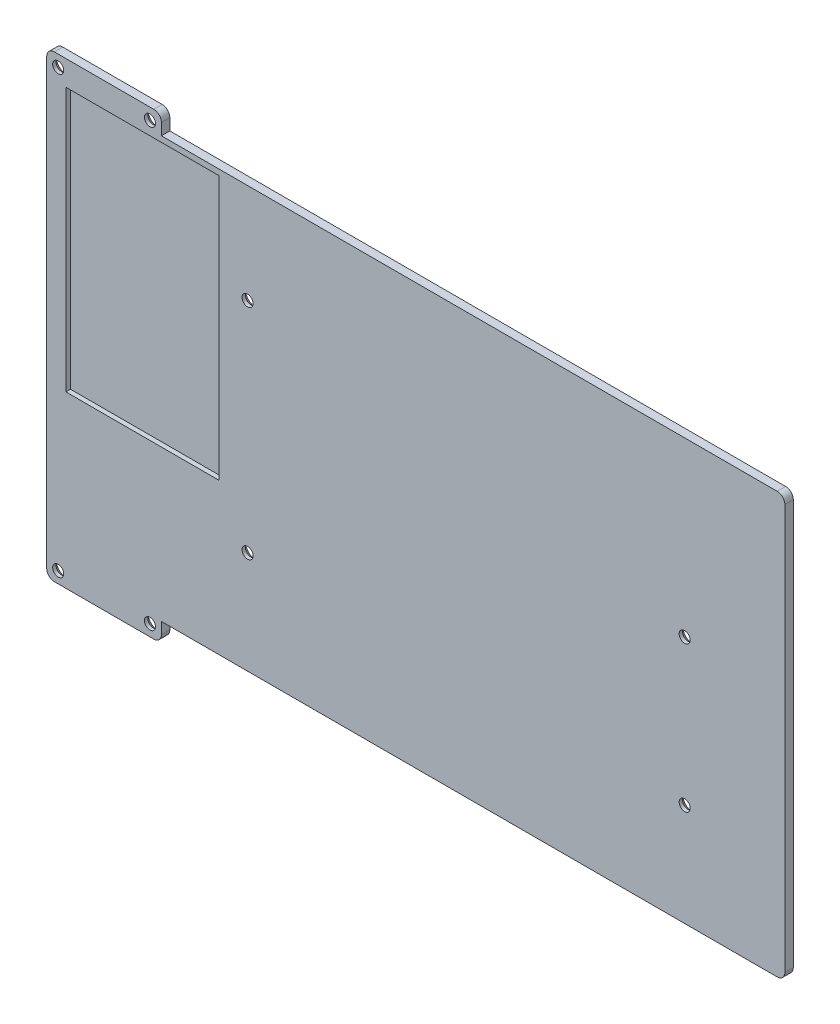
ISO-10303-21;
HEADER;
FILE_DESCRIPTION(('STEP AP214'),'2;1');
FILE_NAME('part.step','',(''),(''),'','','');
FILE_SCHEMA(('AUTOMOTIVE_DESIGN { 1 0 10303 214 1 1 1 1 }'));
ENDSEC;
DATA;
#1=APPLICATION_CONTEXT('core data for automotive mechanical design processes');
#2=APPLICATION_PROTOCOL_DEFINITION('international standard','automotive_design',2000,#1);
#3=PRODUCT_CONTEXT('',#1,'mechanical');
#4=PRODUCT('Part','Part','',(#3));
#5=PRODUCT_RELATED_PRODUCT_CATEGORY('part','',(#4));
#6=PRODUCT_DEFINITION_FORMATION('','',#4);
#7=PRODUCT_DEFINITION_CONTEXT('part definition',#1,'design');
#8=PRODUCT_DEFINITION('design','',#6,#7);
#9=PRODUCT_DEFINITION_SHAPE('','',#8);
#10=(LENGTH_UNIT() NAMED_UNIT(*) SI_UNIT(.MILLI.,.METRE.));
#11=(NAMED_UNIT(*) PLANE_ANGLE_UNIT() SI_UNIT($,.RADIAN.));
#12=(NAMED_UNIT(*) SI_UNIT($,.STERADIAN.) SOLID_ANGLE_UNIT());
#13=UNCERTAINTY_MEASURE_WITH_UNIT(LENGTH_MEASURE(1.E-05),#10,'distance_accuracy_value','');
#14=(GEOMETRIC_REPRESENTATION_CONTEXT(3) GLOBAL_UNCERTAINTY_ASSIGNED_CONTEXT((#13)) GLOBAL_UNIT_ASSIGNED_CONTEXT((#10,
#11,#12)) REPRESENTATION_CONTEXT('',''));
#15=CARTESIAN_POINT('',(0.,0.,0.));
#16=DIRECTION('',(0.,0.,1.));
#17=DIRECTION('',(1.,0.,0.));
#18=AXIS2_PLACEMENT_3D('',#15,#16,#17);
#19=CARTESIAN_POINT('',(59.8774272560033,-20.5678939773836,2.2));
#20=DIRECTION('',(0.,0.,1.));
#21=DIRECTION('',(1.,0.,0.));
#22=AXIS2_PLACEMENT_3D('',#19,#20,#21);
#23=PLANE('',#22);
#24=CARTESIAN_POINT('',(-104.172572743997,89.4321060226163,2.19999999999999));
#25=DIRECTION('',(0.,0.,-1.));
#26=DIRECTION('',(-1.,0.,0.));
#27=AXIS2_PLACEMENT_3D('',#24,#25,#26);
#28=CIRCLE('',#27,1.44999999999999);
#29=CARTESIAN_POINT('',(-105.622572743997,89.4321060226163,2.19999999999999));
#30=VERTEX_POINT('',#29);
#31=EDGE_CURVE('E285',#30,#30,#28,.T.);
#32=ORIENTED_EDGE('',*,*,#31,.T.);
#33=EDGE_LOOP('',(#32));
#34=FACE_BOUND('',#33,.T.);
#35=CARTESIAN_POINT('',(-128.172572743997,89.4321060226163,2.19999999999999));
#36=DIRECTION('',(0.,0.,-1.));
#37=DIRECTION('',(-1.,0.,0.));
#38=AXIS2_PLACEMENT_3D('',#35,#36,#37);
#39=CIRCLE('',#38,1.44999999999998);
#40=CARTESIAN_POINT('',(-129.622572743997,89.4321060226163,2.19999999999999));
#41=VERTEX_POINT('',#40);
#42=EDGE_CURVE('E294',#41,#41,#39,.T.);
#43=ORIENTED_EDGE('',*,*,#42,.T.);
#44=EDGE_LOOP('',(#43));
#45=FACE_BOUND('',#44,.T.);
#46=CARTESIAN_POINT('',(-104.172572743997,-24.5678939773836,2.19999999999999));
#47=DIRECTION('',(0.,0.,-1.));
#48=DIRECTION('',(-1.,0.,0.));
#49=AXIS2_PLACEMENT_3D('',#46,#47,#48);
#50=CIRCLE('',#49,1.44999999999999);
#51=CARTESIAN_POINT('',(-105.622572743997,-24.5678939773836,2.19999999999999));
#52=VERTEX_POINT('',#51);
#53=EDGE_CURVE('E303',#52,#52,#50,.T.);
#54=ORIENTED_EDGE('',*,*,#53,.T.);
#55=EDGE_LOOP('',(#54));
#56=FACE_BOUND('',#55,.T.);
#57=CARTESIAN_POINT('',(-128.172572743997,-24.5678939773836,2.19999999999999));
#58=DIRECTION('',(0.,0.,-1.));
#59=DIRECTION('',(-1.,0.,0.));
#60=AXIS2_PLACEMENT_3D('',#57,#58,#59);
#61=CIRCLE('',#60,1.44999999999998);
#62=CARTESIAN_POINT('',(-129.622572743997,-24.5678939773836,2.19999999999999));
#63=VERTEX_POINT('',#62);
#64=EDGE_CURVE('E312',#63,#63,#61,.T.);
#65=ORIENTED_EDGE('',*,*,#64,.T.);
#66=EDGE_LOOP('',(#65));
#67=FACE_BOUND('',#66,.T.);
#68=CARTESIAN_POINT('',(-78.6475727439967,61.3919922588539,2.2));
#69=DIRECTION('',(0.,0.,-1.));
#70=DIRECTION('',(-1.,0.,0.));
#71=AXIS2_PLACEMENT_3D('',#68,#69,#70);
#72=CIRCLE('',#71,1.44999999999999);
#73=CARTESIAN_POINT('',(-80.0975727439967,61.3919922588539,2.2));
#74=VERTEX_POINT('',#73);
#75=EDGE_CURVE('E321',#74,#74,#72,.T.);
#76=ORIENTED_EDGE('',*,*,#75,.T.);
#77=EDGE_LOOP('',(#76));
#78=FACE_BOUND('',#77,.T.);
#79=CARTESIAN_POINT('',(35.6774272560033,42.3419922588539,2.2));
#80=DIRECTION('',(0.,0.,-1.));
#81=DIRECTION('',(-1.,0.,0.));
#82=AXIS2_PLACEMENT_3D('',#79,#80,#81);
#83=CIRCLE('',#82,1.45);
#84=CARTESIAN_POINT('',(34.2274272560033,42.3419922588539,2.2));
#85=VERTEX_POINT('',#84);
#86=EDGE_CURVE('E330',#85,#85,#83,.T.);
#87=ORIENTED_EDGE('',*,*,#86,.T.);
#88=EDGE_LOOP('',(#87));
#89=FACE_BOUND('',#88,.T.);
#90=CARTESIAN_POINT('',(35.6774272560033,4.24199225885395,2.2));
#91=DIRECTION('',(0.,0.,-1.));
#92=DIRECTION('',(-1.,0.,0.));
#93=AXIS2_PLACEMENT_3D('',#90,#91,#92);
#94=CIRCLE('',#93,1.45);
#95=CARTESIAN_POINT('',(34.2274272560033,4.24199225885395,2.2));
#96=VERTEX_POINT('',#95);
#97=EDGE_CURVE('E339',#96,#96,#94,.T.);
#98=ORIENTED_EDGE('',*,*,#97,.T.);
#99=EDGE_LOOP('',(#98));
#100=FACE_BOUND('',#99,.T.);
#101=CARTESIAN_POINT('',(-78.6475727439967,4.24199225885394,2.2));
#102=DIRECTION('',(0.,0.,-1.));
#103=DIRECTION('',(-1.,0.,0.));
#104=AXIS2_PLACEMENT_3D('',#101,#102,#103);
#105=CIRCLE('',#104,1.44999999999999);
#106=CARTESIAN_POINT('',(-80.0975727439967,4.24199225885394,2.2));
#107=VERTEX_POINT('',#106);
#108=EDGE_CURVE('E190',#107,#107,#105,.T.);
#109=ORIENTED_EDGE('',*,*,#108,.T.);
#110=EDGE_LOOP('',(#109));
#111=FACE_BOUND('',#110,.T.);
#112=CARTESIAN_POINT('',(59.8774272560033,-20.5678939773836,2.2));
#113=DIRECTION('',(0.,0.,1.));
#114=DIRECTION('',(1.,0.,0.));
#115=AXIS2_PLACEMENT_3D('',#112,#113,#114);
#116=CIRCLE('',#115,2.);
#117=CARTESIAN_POINT('',(59.8774272560033,-22.5678939773836,2.2));
#118=VERTEX_POINT('',#117);
#119=CARTESIAN_POINT('',(61.8774272560033,-20.5678939773836,2.2));
#120=VERTEX_POINT('',#119);
#121=EDGE_CURVE('E214',#118,#120,#116,.T.);
#122=ORIENTED_EDGE('',*,*,#121,.T.);
#123=DIRECTION('',(0.,1.,0.));
#124=VECTOR('',#123,1.);
#125=CARTESIAN_POINT('',(61.8774272560033,-20.5678939773836,2.2));
#126=LINE('',#125,#124);
#127=CARTESIAN_POINT('',(61.8774272560033,85.4321060226164,2.2));
#128=VERTEX_POINT('',#127);
#129=EDGE_CURVE('E125',#120,#128,#126,.T.);
#130=ORIENTED_EDGE('',*,*,#129,.T.);
#131=CARTESIAN_POINT('',(59.8774272560033,85.4321060226164,2.2));
#132=DIRECTION('',(0.,0.,1.));
#133=DIRECTION('',(-1.,0.,0.));
#134=AXIS2_PLACEMENT_3D('',#131,#132,#133);
#135=CIRCLE('',#134,2.);
#136=CARTESIAN_POINT('',(59.8774272560033,87.4321060226164,2.2));
#137=VERTEX_POINT('',#136);
#138=EDGE_CURVE('E352',#128,#137,#135,.T.);
#139=ORIENTED_EDGE('',*,*,#138,.T.);
#140=DIRECTION('',(-1.,0.,0.));
#141=VECTOR('',#140,1.);
#142=CARTESIAN_POINT('',(59.8774272560033,87.4321060226164,2.2));
#143=LINE('',#142,#141);
#144=CARTESIAN_POINT('',(-101.172572743997,87.4321060226164,2.2));
#145=VERTEX_POINT('',#144);
#146=EDGE_CURVE('E354',#137,#145,#143,.T.);
#147=ORIENTED_EDGE('',*,*,#146,.T.);
#148=DIRECTION('',(0.,1.,0.));
#149=VECTOR('',#148,1.);
#150=CARTESIAN_POINT('',(-101.172572743997,87.4321060226164,2.2));
#151=LINE('',#150,#149);
#152=CARTESIAN_POINT('',(-101.172572743997,90.4321060226163,2.2));
#153=VERTEX_POINT('',#152);
#154=EDGE_CURVE('E356',#145,#153,#151,.T.);
#155=ORIENTED_EDGE('',*,*,#154,.T.);
#156=CARTESIAN_POINT('',(-103.172572743997,90.4321060226163,2.2));
#157=DIRECTION('',(0.,0.,1.));
#158=DIRECTION('',(-1.,0.,0.));
#159=AXIS2_PLACEMENT_3D('',#156,#157,#158);
#160=CIRCLE('',#159,1.99999999999999);
#161=CARTESIAN_POINT('',(-103.172572743997,92.4321060226163,2.2));
#162=VERTEX_POINT('',#161);
#163=EDGE_CURVE('E358',#153,#162,#160,.T.);
#164=ORIENTED_EDGE('',*,*,#163,.T.);
#165=DIRECTION('',(-1.,0.,0.));
#166=VECTOR('',#165,1.);
#167=CARTESIAN_POINT('',(-129.172572743997,92.4321060226164,2.2));
#168=LINE('',#167,#166);
#169=CARTESIAN_POINT('',(-129.172572743997,92.4321060226164,2.2));
#170=VERTEX_POINT('',#169);
#171=EDGE_CURVE('E360',#162,#170,#168,.T.);
#172=ORIENTED_EDGE('',*,*,#171,.T.);
#173=CARTESIAN_POINT('',(-129.172572743997,90.4321060226164,2.2));
#174=DIRECTION('',(0.,0.,1.));
#175=DIRECTION('',(-1.,0.,0.));
#176=AXIS2_PLACEMENT_3D('',#173,#174,#175);
#177=CIRCLE('',#176,2.00000000000002);
#178=CARTESIAN_POINT('',(-131.172572743997,90.4321060226164,2.2));
#179=VERTEX_POINT('',#178);
#180=EDGE_CURVE('E362',#170,#179,#177,.T.);
#181=ORIENTED_EDGE('',*,*,#180,.T.);
#182=DIRECTION('',(0.,-1.,0.));
#183=VECTOR('',#182,1.);
#184=CARTESIAN_POINT('',(-131.172572743997,-25.5678939773836,2.2));
#185=LINE('',#184,#183);
#186=CARTESIAN_POINT('',(-131.172572743997,-25.5678939773836,2.2));
#187=VERTEX_POINT('',#186);
#188=EDGE_CURVE('E364',#179,#187,#185,.T.);
#189=ORIENTED_EDGE('',*,*,#188,.T.);
#190=CARTESIAN_POINT('',(-129.172572743997,-25.5678939773836,2.2));
#191=DIRECTION('',(0.,0.,1.));
#192=DIRECTION('',(-1.,0.,0.));
#193=AXIS2_PLACEMENT_3D('',#190,#191,#192);
#194=CIRCLE('',#193,2.00000000000001);
#195=CARTESIAN_POINT('',(-129.172572743997,-27.5678939773836,2.2));
#196=VERTEX_POINT('',#195);
#197=EDGE_CURVE('E366',#187,#196,#194,.T.);
#198=ORIENTED_EDGE('',*,*,#197,.T.);
#199=DIRECTION('',(1.,0.,0.));
#200=VECTOR('',#199,1.);
#201=CARTESIAN_POINT('',(-129.172572743997,-27.5678939773836,2.2));
#202=LINE('',#201,#200);
#203=CARTESIAN_POINT('',(-103.172572743997,-27.5678939773836,2.2));
#204=VERTEX_POINT('',#203);
#205=EDGE_CURVE('E165',#196,#204,#202,.T.);
#206=ORIENTED_EDGE('',*,*,#205,.T.);
#207=CARTESIAN_POINT('',(-103.172572743997,-25.5678939773836,2.2));
#208=DIRECTION('',(0.,0.,1.));
#209=DIRECTION('',(1.,0.,0.));
#210=AXIS2_PLACEMENT_3D('',#207,#208,#209);
#211=CIRCLE('',#210,2.);
#212=CARTESIAN_POINT('',(-101.172572743997,-25.5678939773836,2.2));
#213=VERTEX_POINT('',#212);
#214=EDGE_CURVE('E158',#204,#213,#211,.T.);
#215=ORIENTED_EDGE('',*,*,#214,.T.);
#216=DIRECTION('',(0.,1.,0.));
#217=VECTOR('',#216,1.);
#218=CARTESIAN_POINT('',(-101.172572743997,-22.5678939773836,2.2));
#219=LINE('',#218,#217);
#220=CARTESIAN_POINT('',(-101.172572743997,-22.5678939773836,2.2));
#221=VERTEX_POINT('',#220);
#222=EDGE_CURVE('E162',#213,#221,#219,.T.);
#223=ORIENTED_EDGE('',*,*,#222,.T.);
#224=DIRECTION('',(1.,0.,0.));
#225=VECTOR('',#224,1.);
#226=CARTESIAN_POINT('',(59.8774272560033,-22.5678939773836,2.2));
#227=LINE('',#226,#225);
#228=EDGE_CURVE('E65',#221,#118,#227,.T.);
#229=ORIENTED_EDGE('',*,*,#228,.T.);
#230=EDGE_LOOP('',(#122,#130,#139,#147,#155,#164,#172,#181,#189,#198,#206,#215,#223,#229));
#231=FACE_BOUND('',#230,.T.);
#232=DIRECTION('',(-1.,0.,0.));
#233=VECTOR('',#232,1.);
#234=CARTESIAN_POINT('',(59.8774272560033,16.9321060226164,2.2));
#235=LINE('',#234,#233);
#236=CARTESIAN_POINT('',(-86.1725727439967,16.9321060226164,2.2));
#237=VERTEX_POINT('',#236);
#238=CARTESIAN_POINT('',(-126.172572743997,16.9321060226164,2.2));
#239=VERTEX_POINT('',#238);
#240=EDGE_CURVE('E49',#237,#239,#235,.T.);
#241=ORIENTED_EDGE('',*,*,#240,.T.);
#242=DIRECTION('',(0.,1.,0.));
#243=VECTOR('',#242,1.);
#244=CARTESIAN_POINT('',(-126.172572743997,-20.5678939773836,2.2));
#245=LINE('',#244,#243);
#246=CARTESIAN_POINT('',(-126.172572743997,85.9321060226164,2.2));
#247=VERTEX_POINT('',#246);
#248=EDGE_CURVE('E11',#239,#247,#245,.T.);
#249=ORIENTED_EDGE('',*,*,#248,.T.);
#250=DIRECTION('',(1.,0.,0.));
#251=VECTOR('',#250,1.);
#252=CARTESIAN_POINT('',(59.8774272560033,85.9321060226164,2.2));
#253=LINE('',#252,#251);
#254=CARTESIAN_POINT('',(-86.1725727439967,85.9321060226164,2.2));
#255=VERTEX_POINT('',#254);
#256=EDGE_CURVE('E247',#247,#255,#253,.T.);
#257=ORIENTED_EDGE('',*,*,#256,.T.);
#258=DIRECTION('',(0.,-1.,0.));
#259=VECTOR('',#258,1.);
#260=CARTESIAN_POINT('',(-86.1725727439967,-20.5678939773836,2.2));
#261=LINE('',#260,#259);
#262=EDGE_CURVE('E250',#255,#237,#261,.T.);
#263=ORIENTED_EDGE('',*,*,#262,.T.);
#264=EDGE_LOOP('',(#241,#249,#257,#263));
#265=FACE_BOUND('',#264,.T.);
#266=ADVANCED_FACE('F41',(#34,#45,#56,#67,#78,#89,#100,#111,#231,#265),#23,.T.);
#267=CARTESIAN_POINT('',(59.8774272560033,-20.5678939773836,0.));
#268=DIRECTION('',(0.,0.,1.));
#269=DIRECTION('',(1.,0.,0.));
#270=AXIS2_PLACEMENT_3D('',#267,#268,#269);
#271=PLANE('',#270);
#272=CARTESIAN_POINT('',(-104.172572743997,89.4321060226163,0.));
#273=DIRECTION('',(0.,0.,-1.));
#274=DIRECTION('',(-1.,0.,0.));
#275=AXIS2_PLACEMENT_3D('',#272,#273,#274);
#276=CIRCLE('',#275,2.75);
#277=CARTESIAN_POINT('',(-106.922572743997,89.4321060226163,0.));
#278=VERTEX_POINT('',#277);
#279=EDGE_CURVE('E274',#278,#278,#276,.T.);
#280=ORIENTED_EDGE('',*,*,#279,.F.);
#281=EDGE_LOOP('',(#280));
#282=FACE_BOUND('',#281,.T.);
#283=CARTESIAN_POINT('',(-128.172572743997,89.4321060226163,0.));
#284=DIRECTION('',(0.,0.,-1.));
#285=DIRECTION('',(-1.,0.,0.));
#286=AXIS2_PLACEMENT_3D('',#283,#284,#285);
#287=CIRCLE('',#286,2.75);
#288=CARTESIAN_POINT('',(-130.922572743997,89.4321060226163,0.));
#289=VERTEX_POINT('',#288);
#290=EDGE_CURVE('E288',#289,#289,#287,.T.);
#291=ORIENTED_EDGE('',*,*,#290,.F.);
#292=EDGE_LOOP('',(#291));
#293=FACE_BOUND('',#292,.T.);
#294=CARTESIAN_POINT('',(-104.172572743997,-24.5678939773836,0.));
#295=DIRECTION('',(0.,0.,-1.));
#296=DIRECTION('',(-1.,0.,0.));
#297=AXIS2_PLACEMENT_3D('',#294,#295,#296);
#298=CIRCLE('',#297,2.75);
#299=CARTESIAN_POINT('',(-106.922572743997,-24.5678939773836,0.));
#300=VERTEX_POINT('',#299);
#301=EDGE_CURVE('E297',#300,#300,#298,.T.);
#302=ORIENTED_EDGE('',*,*,#301,.F.);
#303=EDGE_LOOP('',(#302));
#304=FACE_BOUND('',#303,.T.);
#305=CARTESIAN_POINT('',(-78.6475727439967,61.3919922588539,0.));
#306=DIRECTION('',(0.,0.,-1.));
#307=DIRECTION('',(-1.,0.,0.));
#308=AXIS2_PLACEMENT_3D('',#305,#306,#307);
#309=CIRCLE('',#308,2.75);
#310=CARTESIAN_POINT('',(-81.3975727439967,61.3919922588539,0.));
#311=VERTEX_POINT('',#310);
#312=EDGE_CURVE('E315',#311,#311,#309,.T.);
#313=ORIENTED_EDGE('',*,*,#312,.F.);
#314=EDGE_LOOP('',(#313));
#315=FACE_BOUND('',#314,.T.);
#316=CARTESIAN_POINT('',(35.6774272560033,42.3419922588539,0.));
#317=DIRECTION('',(0.,0.,-1.));
#318=DIRECTION('',(-1.,0.,0.));
#319=AXIS2_PLACEMENT_3D('',#316,#317,#318);
#320=CIRCLE('',#319,2.75);
#321=CARTESIAN_POINT('',(32.9274272560033,42.3419922588539,0.));
#322=VERTEX_POINT('',#321);
#323=EDGE_CURVE('E324',#322,#322,#320,.T.);
#324=ORIENTED_EDGE('',*,*,#323,.F.);
#325=EDGE_LOOP('',(#324));
#326=FACE_BOUND('',#325,.T.);
#327=CARTESIAN_POINT('',(35.6774272560033,4.24199225885395,0.));
#328=DIRECTION('',(0.,0.,-1.));
#329=DIRECTION('',(-1.,0.,0.));
#330=AXIS2_PLACEMENT_3D('',#327,#328,#329);
#331=CIRCLE('',#330,2.75);
#332=CARTESIAN_POINT('',(32.9274272560033,4.24199225885395,0.));
#333=VERTEX_POINT('',#332);
#334=EDGE_CURVE('E333',#333,#333,#331,.T.);
#335=ORIENTED_EDGE('',*,*,#334,.F.);
#336=EDGE_LOOP('',(#335));
#337=FACE_BOUND('',#336,.T.);
#338=CARTESIAN_POINT('',(-78.6475727439967,4.24199225885394,0.));
#339=DIRECTION('',(0.,0.,-1.));
#340=DIRECTION('',(-1.,0.,0.));
#341=AXIS2_PLACEMENT_3D('',#338,#339,#340);
#342=CIRCLE('',#341,2.75);
#343=CARTESIAN_POINT('',(-81.3975727439967,4.24199225885394,0.));
#344=VERTEX_POINT('',#343);
#345=EDGE_CURVE('E342',#344,#344,#342,.T.);
#346=ORIENTED_EDGE('',*,*,#345,.F.);
#347=EDGE_LOOP('',(#346));
#348=FACE_BOUND('',#347,.T.);
#349=CARTESIAN_POINT('',(59.8774272560033,-20.5678939773836,0.));
#350=DIRECTION('',(0.,0.,1.));
#351=DIRECTION('',(1.,0.,0.));
#352=AXIS2_PLACEMENT_3D('',#349,#350,#351);
#353=CIRCLE('',#352,2.);
#354=CARTESIAN_POINT('',(59.8774272560033,-22.5678939773836,0.));
#355=VERTEX_POINT('',#354);
#356=CARTESIAN_POINT('',(61.8774272560033,-20.5678939773836,0.));
#357=VERTEX_POINT('',#356);
#358=EDGE_CURVE('E186',#355,#357,#353,.T.);
#359=ORIENTED_EDGE('',*,*,#358,.F.);
#360=DIRECTION('',(1.,0.,0.));
#361=VECTOR('',#360,1.);
#362=CARTESIAN_POINT('',(59.8774272560033,-22.5678939773836,0.));
#363=LINE('',#362,#361);
#364=CARTESIAN_POINT('',(-101.172572743997,-22.5678939773836,0.));
#365=VERTEX_POINT('',#364);
#366=EDGE_CURVE('E116',#365,#355,#363,.T.);
#367=ORIENTED_EDGE('',*,*,#366,.F.);
#368=DIRECTION('',(0.,1.,0.));
#369=VECTOR('',#368,1.);
#370=CARTESIAN_POINT('',(-101.172572743997,-22.5678939773836,0.));
#371=LINE('',#370,#369);
#372=CARTESIAN_POINT('',(-101.172572743997,-25.5678939773836,0.));
#373=VERTEX_POINT('',#372);
#374=EDGE_CURVE('E211',#373,#365,#371,.T.);
#375=ORIENTED_EDGE('',*,*,#374,.F.);
#376=CARTESIAN_POINT('',(-103.172572743997,-25.5678939773836,0.));
#377=DIRECTION('',(0.,0.,1.));
#378=DIRECTION('',(1.,0.,0.));
#379=AXIS2_PLACEMENT_3D('',#376,#377,#378);
#380=CIRCLE('',#379,2.);
#381=CARTESIAN_POINT('',(-103.172572743997,-27.5678939773836,0.));
#382=VERTEX_POINT('',#381);
#383=EDGE_CURVE('E174',#382,#373,#380,.T.);
#384=ORIENTED_EDGE('',*,*,#383,.F.);
#385=DIRECTION('',(1.,0.,0.));
#386=VECTOR('',#385,1.);
#387=CARTESIAN_POINT('',(-129.172572743997,-27.5678939773836,0.));
#388=LINE('',#387,#386);
#389=CARTESIAN_POINT('',(-129.172572743997,-27.5678939773836,0.));
#390=VERTEX_POINT('',#389);
#391=EDGE_CURVE('E208',#390,#382,#388,.T.);
#392=ORIENTED_EDGE('',*,*,#391,.F.);
#393=CARTESIAN_POINT('',(-129.172572743997,-25.5678939773836,0.));
#394=DIRECTION('',(0.,0.,1.));
#395=DIRECTION('',(-1.,0.,0.));
#396=AXIS2_PLACEMENT_3D('',#393,#394,#395);
#397=CIRCLE('',#396,2.00000000000001);
#398=CARTESIAN_POINT('',(-131.172572743997,-25.5678939773836,0.));
#399=VERTEX_POINT('',#398);
#400=EDGE_CURVE('E206',#399,#390,#397,.T.);
#401=ORIENTED_EDGE('',*,*,#400,.F.);
#402=DIRECTION('',(0.,-1.,0.));
#403=VECTOR('',#402,1.);
#404=CARTESIAN_POINT('',(-131.172572743997,-25.5678939773836,0.));
#405=LINE('',#404,#403);
#406=CARTESIAN_POINT('',(-131.172572743997,90.4321060226164,0.));
#407=VERTEX_POINT('',#406);
#408=EDGE_CURVE('E204',#407,#399,#405,.T.);
#409=ORIENTED_EDGE('',*,*,#408,.F.);
#410=CARTESIAN_POINT('',(-129.172572743997,90.4321060226164,0.));
#411=DIRECTION('',(0.,0.,1.));
#412=DIRECTION('',(-1.,0.,0.));
#413=AXIS2_PLACEMENT_3D('',#410,#411,#412);
#414=CIRCLE('',#413,2.00000000000002);
#415=CARTESIAN_POINT('',(-129.172572743997,92.4321060226164,0.));
#416=VERTEX_POINT('',#415);
#417=EDGE_CURVE('E202',#416,#407,#414,.T.);
#418=ORIENTED_EDGE('',*,*,#417,.F.);
#419=DIRECTION('',(-1.,0.,0.));
#420=VECTOR('',#419,1.);
#421=CARTESIAN_POINT('',(-129.172572743997,92.4321060226164,0.));
#422=LINE('',#421,#420);
#423=CARTESIAN_POINT('',(-103.172572743997,92.4321060226163,0.));
#424=VERTEX_POINT('',#423);
#425=EDGE_CURVE('E200',#424,#416,#422,.T.);
#426=ORIENTED_EDGE('',*,*,#425,.F.);
#427=CARTESIAN_POINT('',(-103.172572743997,90.4321060226163,0.));
#428=DIRECTION('',(0.,0.,1.));
#429=DIRECTION('',(-1.,0.,0.));
#430=AXIS2_PLACEMENT_3D('',#427,#428,#429);
#431=CIRCLE('',#430,1.99999999999999);
#432=CARTESIAN_POINT('',(-101.172572743997,90.4321060226163,0.));
#433=VERTEX_POINT('',#432);
#434=EDGE_CURVE('E198',#433,#424,#431,.T.);
#435=ORIENTED_EDGE('',*,*,#434,.F.);
#436=DIRECTION('',(0.,1.,0.));
#437=VECTOR('',#436,1.);
#438=CARTESIAN_POINT('',(-101.172572743997,87.4321060226164,0.));
#439=LINE('',#438,#437);
#440=CARTESIAN_POINT('',(-101.172572743997,87.4321060226164,0.));
#441=VERTEX_POINT('',#440);
#442=EDGE_CURVE('E196',#441,#433,#439,.T.);
#443=ORIENTED_EDGE('',*,*,#442,.F.);
#444=DIRECTION('',(-1.,0.,0.));
#445=VECTOR('',#444,1.);
#446=CARTESIAN_POINT('',(59.8774272560033,87.4321060226164,0.));
#447=LINE('',#446,#445);
#448=CARTESIAN_POINT('',(59.8774272560033,87.4321060226164,0.));
#449=VERTEX_POINT('',#448);
#450=EDGE_CURVE('E194',#449,#441,#447,.T.);
#451=ORIENTED_EDGE('',*,*,#450,.F.);
#452=CARTESIAN_POINT('',(59.8774272560033,85.4321060226164,0.));
#453=DIRECTION('',(0.,0.,1.));
#454=DIRECTION('',(-1.,0.,0.));
#455=AXIS2_PLACEMENT_3D('',#452,#453,#454);
#456=CIRCLE('',#455,2.);
#457=CARTESIAN_POINT('',(61.8774272560033,85.4321060226164,0.));
#458=VERTEX_POINT('',#457);
#459=EDGE_CURVE('E192',#458,#449,#456,.T.);
#460=ORIENTED_EDGE('',*,*,#459,.F.);
#461=DIRECTION('',(0.,1.,0.));
#462=VECTOR('',#461,1.);
#463=CARTESIAN_POINT('',(61.8774272560033,-20.5678939773836,0.));
#464=LINE('',#463,#462);
#465=EDGE_CURVE('E189',#357,#458,#464,.T.);
#466=ORIENTED_EDGE('',*,*,#465,.F.);
#467=EDGE_LOOP('',(#359,#367,#375,#384,#392,#401,#409,#418,#426,#435,#443,#451,#460,#466));
#468=FACE_BOUND('',#467,.T.);
#469=CARTESIAN_POINT('',(-128.172572743997,-24.5678939773836,0.));
#470=DIRECTION('',(0.,0.,-1.));
#471=DIRECTION('',(-1.,0.,0.));
#472=AXIS2_PLACEMENT_3D('',#469,#470,#471);
#473=CIRCLE('',#472,2.75);
#474=CARTESIAN_POINT('',(-130.922572743997,-24.5678939773836,0.));
#475=VERTEX_POINT('',#474);
#476=EDGE_CURVE('E306',#475,#475,#473,.T.);
#477=ORIENTED_EDGE('',*,*,#476,.F.);
#478=EDGE_LOOP('',(#477));
#479=FACE_BOUND('',#478,.T.);
#480=ADVANCED_FACE('F379',(#282,#293,#304,#315,#326,#337,#348,#468,#479),#271,.F.);
#481=CARTESIAN_POINT('',(59.8774272560033,-20.5678939773836,2.2));
#482=DIRECTION('',(0.,0.,-1.));
#483=DIRECTION('',(-1.,0.,0.));
#484=AXIS2_PLACEMENT_3D('',#481,#482,#483);
#485=CYLINDRICAL_SURFACE('',#484,2.);
#486=ORIENTED_EDGE('',*,*,#358,.T.);
#487=DIRECTION('',(0.,0.,-1.));
#488=VECTOR('',#487,1.);
#489=CARTESIAN_POINT('',(61.8774272560033,-20.5678939773836,2.2));
#490=LINE('',#489,#488);
#491=EDGE_CURVE('E245',#120,#357,#490,.T.);
#492=ORIENTED_EDGE('',*,*,#491,.F.);
#493=ORIENTED_EDGE('',*,*,#121,.F.);
#494=DIRECTION('',(0.,0.,-1.));
#495=VECTOR('',#494,1.);
#496=CARTESIAN_POINT('',(59.8774272560033,-22.5678939773836,2.2));
#497=LINE('',#496,#495);
#498=EDGE_CURVE('E182',#118,#355,#497,.T.);
#499=ORIENTED_EDGE('',*,*,#498,.T.);
#500=EDGE_LOOP('',(#486,#492,#493,#499));
#501=FACE_BOUND('',#500,.T.);
#502=ADVANCED_FACE('F43',(#501),#485,.T.);
#503=CARTESIAN_POINT('',(61.8774272560033,-20.5678939773836,2.2));
#504=DIRECTION('',(-1.,0.,0.));
#505=DIRECTION('',(0.,-1.,0.));
#506=AXIS2_PLACEMENT_3D('',#503,#504,#505);
#507=PLANE('',#506);
#508=ORIENTED_EDGE('',*,*,#465,.T.);
#509=DIRECTION('',(0.,0.,-1.));
#510=VECTOR('',#509,1.);
#511=CARTESIAN_POINT('',(61.8774272560033,85.4321060226164,2.2));
#512=LINE('',#511,#510);
#513=EDGE_CURVE('E242',#128,#458,#512,.T.);
#514=ORIENTED_EDGE('',*,*,#513,.F.);
#515=ORIENTED_EDGE('',*,*,#129,.F.);
#516=ORIENTED_EDGE('',*,*,#491,.T.);
#517=EDGE_LOOP('',(#508,#514,#515,#516));
#518=FACE_BOUND('',#517,.T.);
#519=ADVANCED_FACE('F387',(#518),#507,.F.);
#520=CARTESIAN_POINT('',(59.8774272560033,85.4321060226164,2.2));
#521=DIRECTION('',(0.,0.,-1.));
#522=DIRECTION('',(-1.,0.,0.));
#523=AXIS2_PLACEMENT_3D('',#520,#521,#522);
#524=CYLINDRICAL_SURFACE('',#523,2.);
#525=ORIENTED_EDGE('',*,*,#459,.T.);
#526=DIRECTION('',(0.,0.,-1.));
#527=VECTOR('',#526,1.);
#528=CARTESIAN_POINT('',(59.8774272560033,87.4321060226164,2.2));
#529=LINE('',#528,#527);
#530=EDGE_CURVE('E239',#137,#449,#529,.T.);
#531=ORIENTED_EDGE('',*,*,#530,.F.);
#532=ORIENTED_EDGE('',*,*,#138,.F.);
#533=ORIENTED_EDGE('',*,*,#513,.T.);
#534=EDGE_LOOP('',(#525,#531,#532,#533));
#535=FACE_BOUND('',#534,.T.);
#536=ADVANCED_FACE('F390',(#535),#524,.T.);
#537=CARTESIAN_POINT('',(59.8774272560033,87.4321060226164,2.2));
#538=DIRECTION('',(0.,-1.,0.));
#539=DIRECTION('',(1.,0.,0.));
#540=AXIS2_PLACEMENT_3D('',#537,#538,#539);
#541=PLANE('',#540);
#542=ORIENTED_EDGE('',*,*,#450,.T.);
#543=DIRECTION('',(0.,0.,-1.));
#544=VECTOR('',#543,1.);
#545=CARTESIAN_POINT('',(-101.172572743997,87.4321060226164,2.2));
#546=LINE('',#545,#544);
#547=EDGE_CURVE('E236',#145,#441,#546,.T.);
#548=ORIENTED_EDGE('',*,*,#547,.F.);
#549=ORIENTED_EDGE('',*,*,#146,.F.);
#550=ORIENTED_EDGE('',*,*,#530,.T.);
#551=EDGE_LOOP('',(#542,#548,#549,#550));
#552=FACE_BOUND('',#551,.T.);
#553=ADVANCED_FACE('F395',(#552),#541,.F.);
#554=CARTESIAN_POINT('',(-101.172572743997,87.4321060226164,2.2));
#555=DIRECTION('',(-1.,0.,0.));
#556=DIRECTION('',(0.,0.,1.));
#557=AXIS2_PLACEMENT_3D('',#554,#555,#556);
#558=PLANE('',#557);
#559=ORIENTED_EDGE('',*,*,#442,.T.);
#560=DIRECTION('',(0.,0.,-1.));
#561=VECTOR('',#560,1.);
#562=CARTESIAN_POINT('',(-101.172572743997,90.4321060226163,2.2));
#563=LINE('',#562,#561);
#564=EDGE_CURVE('E233',#153,#433,#563,.T.);
#565=ORIENTED_EDGE('',*,*,#564,.F.);
#566=ORIENTED_EDGE('',*,*,#154,.F.);
#567=ORIENTED_EDGE('',*,*,#547,.T.);
#568=EDGE_LOOP('',(#559,#565,#566,#567));
#569=FACE_BOUND('',#568,.T.);
#570=ADVANCED_FACE('F401',(#569),#558,.F.);
#571=CARTESIAN_POINT('',(-103.172572743997,90.4321060226163,2.2));
#572=DIRECTION('',(0.,0.,-1.));
#573=DIRECTION('',(-1.,0.,0.));
#574=AXIS2_PLACEMENT_3D('',#571,#572,#573);
#575=CYLINDRICAL_SURFACE('',#574,1.99999999999999);
#576=ORIENTED_EDGE('',*,*,#434,.T.);
#577=DIRECTION('',(0.,0.,-1.));
#578=VECTOR('',#577,1.);
#579=CARTESIAN_POINT('',(-103.172572743997,92.4321060226163,2.2));
#580=LINE('',#579,#578);
#581=EDGE_CURVE('E230',#162,#424,#580,.T.);
#582=ORIENTED_EDGE('',*,*,#581,.F.);
#583=ORIENTED_EDGE('',*,*,#163,.F.);
#584=ORIENTED_EDGE('',*,*,#564,.T.);
#585=EDGE_LOOP('',(#576,#582,#583,#584));
#586=FACE_BOUND('',#585,.T.);
#587=ADVANCED_FACE('F405',(#586),#575,.T.);
#588=CARTESIAN_POINT('',(-129.172572743997,92.4321060226164,2.2));
#589=DIRECTION('',(0.,-1.,0.));
#590=DIRECTION('',(1.,0.,0.));
#591=AXIS2_PLACEMENT_3D('',#588,#589,#590);
#592=PLANE('',#591);
#593=ORIENTED_EDGE('',*,*,#425,.T.);
#594=DIRECTION('',(0.,0.,-1.));
#595=VECTOR('',#594,1.);
#596=CARTESIAN_POINT('',(-129.172572743997,92.4321060226164,2.2));
#597=LINE('',#596,#595);
#598=EDGE_CURVE('E227',#170,#416,#597,.T.);
#599=ORIENTED_EDGE('',*,*,#598,.F.);
#600=ORIENTED_EDGE('',*,*,#171,.F.);
#601=ORIENTED_EDGE('',*,*,#581,.T.);
#602=EDGE_LOOP('',(#593,#599,#600,#601));
#603=FACE_BOUND('',#602,.T.);
#604=ADVANCED_FACE('F410',(#603),#592,.F.);
#605=CARTESIAN_POINT('',(-129.172572743997,90.4321060226164,2.2));
#606=DIRECTION('',(0.,0.,-1.));
#607=DIRECTION('',(-1.,0.,0.));
#608=AXIS2_PLACEMENT_3D('',#605,#606,#607);
#609=CYLINDRICAL_SURFACE('',#608,2.00000000000002);
#610=ORIENTED_EDGE('',*,*,#417,.T.);
#611=DIRECTION('',(0.,0.,-1.));
#612=VECTOR('',#611,1.);
#613=CARTESIAN_POINT('',(-131.172572743997,90.4321060226164,2.2));
#614=LINE('',#613,#612);
#615=EDGE_CURVE('E224',#179,#407,#614,.T.);
#616=ORIENTED_EDGE('',*,*,#615,.F.);
#617=ORIENTED_EDGE('',*,*,#180,.F.);
#618=ORIENTED_EDGE('',*,*,#598,.T.);
#619=EDGE_LOOP('',(#610,#616,#617,#618));
#620=FACE_BOUND('',#619,.T.);
#621=ADVANCED_FACE('F414',(#620),#609,.T.);
#622=CARTESIAN_POINT('',(-131.172572743997,-25.5678939773836,2.2));
#623=DIRECTION('',(1.,0.,0.));
#624=DIRECTION('',(0.,0.,-1.));
#625=AXIS2_PLACEMENT_3D('',#622,#623,#624);
#626=PLANE('',#625);
#627=ORIENTED_EDGE('',*,*,#408,.T.);
#628=DIRECTION('',(0.,0.,-1.));
#629=VECTOR('',#628,1.);
#630=CARTESIAN_POINT('',(-131.172572743997,-25.5678939773836,2.2));
#631=LINE('',#630,#629);
#632=EDGE_CURVE('E221',#187,#399,#631,.T.);
#633=ORIENTED_EDGE('',*,*,#632,.F.);
#634=ORIENTED_EDGE('',*,*,#188,.F.);
#635=ORIENTED_EDGE('',*,*,#615,.T.);
#636=EDGE_LOOP('',(#627,#633,#634,#635));
#637=FACE_BOUND('',#636,.T.);
#638=ADVANCED_FACE('F418',(#637),#626,.F.);
#639=CARTESIAN_POINT('',(-129.172572743997,-25.5678939773836,2.2));
#640=DIRECTION('',(0.,0.,-1.));
#641=DIRECTION('',(-1.,0.,0.));
#642=AXIS2_PLACEMENT_3D('',#639,#640,#641);
#643=CYLINDRICAL_SURFACE('',#642,2.00000000000001);
#644=ORIENTED_EDGE('',*,*,#400,.T.);
#645=DIRECTION('',(0.,0.,-1.));
#646=VECTOR('',#645,1.);
#647=CARTESIAN_POINT('',(-129.172572743997,-27.5678939773836,2.2));
#648=LINE('',#647,#646);
#649=EDGE_CURVE('E218',#196,#390,#648,.T.);
#650=ORIENTED_EDGE('',*,*,#649,.F.);
#651=ORIENTED_EDGE('',*,*,#197,.F.);
#652=ORIENTED_EDGE('',*,*,#632,.T.);
#653=EDGE_LOOP('',(#644,#650,#651,#652));
#654=FACE_BOUND('',#653,.T.);
#655=ADVANCED_FACE('F372',(#654),#643,.T.);
#656=CARTESIAN_POINT('',(-129.172572743997,-27.5678939773836,2.2));
#657=DIRECTION('',(0.,1.,0.));
#658=DIRECTION('',(-1.,0.,0.));
#659=AXIS2_PLACEMENT_3D('',#656,#657,#658);
#660=PLANE('',#659);
#661=ORIENTED_EDGE('',*,*,#391,.T.);
#662=DIRECTION('',(0.,0.,-1.));
#663=VECTOR('',#662,1.);
#664=CARTESIAN_POINT('',(-103.172572743997,-27.5678939773836,2.2));
#665=LINE('',#664,#663);
#666=EDGE_CURVE('E177',#204,#382,#665,.T.);
#667=ORIENTED_EDGE('',*,*,#666,.F.);
#668=ORIENTED_EDGE('',*,*,#205,.F.);
#669=ORIENTED_EDGE('',*,*,#649,.T.);
#670=EDGE_LOOP('',(#661,#667,#668,#669));
#671=FACE_BOUND('',#670,.T.);
#672=ADVANCED_FACE('F376',(#671),#660,.F.);
#673=CARTESIAN_POINT('',(-103.172572743997,-25.5678939773836,2.2));
#674=DIRECTION('',(0.,0.,-1.));
#675=DIRECTION('',(-1.,0.,0.));
#676=AXIS2_PLACEMENT_3D('',#673,#674,#675);
#677=CYLINDRICAL_SURFACE('',#676,2.);
#678=ORIENTED_EDGE('',*,*,#383,.T.);
#679=DIRECTION('',(0.,0.,-1.));
#680=VECTOR('',#679,1.);
#681=CARTESIAN_POINT('',(-101.172572743997,-25.5678939773836,2.2));
#682=LINE('',#681,#680);
#683=EDGE_CURVE('E171',#213,#373,#682,.T.);
#684=ORIENTED_EDGE('',*,*,#683,.F.);
#685=ORIENTED_EDGE('',*,*,#214,.F.);
#686=ORIENTED_EDGE('',*,*,#666,.T.);
#687=EDGE_LOOP('',(#678,#684,#685,#686));
#688=FACE_BOUND('',#687,.T.);
#689=ADVANCED_FACE('F172',(#688),#677,.T.);
#690=CARTESIAN_POINT('',(-101.172572743997,-22.5678939773836,2.2));
#691=DIRECTION('',(-1.,0.,0.));
#692=DIRECTION('',(0.,0.,1.));
#693=AXIS2_PLACEMENT_3D('',#690,#691,#692);
#694=PLANE('',#693);
#695=ORIENTED_EDGE('',*,*,#374,.T.);
#696=DIRECTION('',(0.,0.,-1.));
#697=VECTOR('',#696,1.);
#698=CARTESIAN_POINT('',(-101.172572743997,-22.5678939773836,2.2));
#699=LINE('',#698,#697);
#700=EDGE_CURVE('E178',#221,#365,#699,.T.);
#701=ORIENTED_EDGE('',*,*,#700,.F.);
#702=ORIENTED_EDGE('',*,*,#222,.F.);
#703=ORIENTED_EDGE('',*,*,#683,.T.);
#704=EDGE_LOOP('',(#695,#701,#702,#703));
#705=FACE_BOUND('',#704,.T.);
#706=ADVANCED_FACE('F180',(#705),#694,.F.);
#707=CARTESIAN_POINT('',(59.8774272560033,-22.5678939773836,2.2));
#708=DIRECTION('',(0.,1.,0.));
#709=DIRECTION('',(-1.,0.,0.));
#710=AXIS2_PLACEMENT_3D('',#707,#708,#709);
#711=PLANE('',#710);
#712=ORIENTED_EDGE('',*,*,#366,.T.);
#713=ORIENTED_EDGE('',*,*,#498,.F.);
#714=ORIENTED_EDGE('',*,*,#228,.F.);
#715=ORIENTED_EDGE('',*,*,#700,.T.);
#716=EDGE_LOOP('',(#712,#713,#714,#715));
#717=FACE_BOUND('',#716,.T.);
#718=ADVANCED_FACE('F381',(#717),#711,.F.);
#719=CARTESIAN_POINT('',(-78.6475727439967,4.24199225885394,0.));
#720=DIRECTION('',(0.,0.,-1.));
#721=DIRECTION('',(-1.,0.,0.));
#722=AXIS2_PLACEMENT_3D('',#719,#720,#721);
#723=CYLINDRICAL_SURFACE('',#722,1.44999999999999);
#724=ORIENTED_EDGE('',*,*,#108,.F.);
#725=EDGE_LOOP('',(#724));
#726=FACE_BOUND('',#725,.T.);
#727=CARTESIAN_POINT('',(-78.6475727439967,4.24199225885394,1.3));
#728=DIRECTION('',(0.,0.,-1.));
#729=DIRECTION('',(-1.,0.,0.));
#730=AXIS2_PLACEMENT_3D('',#727,#728,#729);
#731=CIRCLE('',#730,1.44999999999999);
#732=CARTESIAN_POINT('',(-80.0975727439967,4.24199225885394,1.3));
#733=VERTEX_POINT('',#732);
#734=EDGE_CURVE('E345',#733,#733,#731,.T.);
#735=ORIENTED_EDGE('',*,*,#734,.T.);
#736=EDGE_LOOP('',(#735));
#737=FACE_BOUND('',#736,.T.);
#738=ADVANCED_FACE('F439',(#726,#737),#723,.F.);
#739=CARTESIAN_POINT('',(-78.6475727439967,4.24199225885394,0.));
#740=DIRECTION('',(0.,0.,-1.));
#741=DIRECTION('',(-1.,0.,0.));
#742=AXIS2_PLACEMENT_3D('',#739,#740,#741);
#743=CONICAL_SURFACE('',#742,2.75,0.785398163397451);
#744=ORIENTED_EDGE('',*,*,#734,.F.);
#745=EDGE_LOOP('',(#744));
#746=FACE_BOUND('',#745,.T.);
#747=ORIENTED_EDGE('',*,*,#345,.T.);
#748=EDGE_LOOP('',(#747));
#749=FACE_BOUND('',#748,.T.);
#750=ADVANCED_FACE('F475',(#746,#749),#743,.F.);
#751=CARTESIAN_POINT('',(35.6774272560033,4.24199225885395,0.));
#752=DIRECTION('',(0.,0.,-1.));
#753=DIRECTION('',(-1.,0.,0.));
#754=AXIS2_PLACEMENT_3D('',#751,#752,#753);
#755=CYLINDRICAL_SURFACE('',#754,1.45);
#756=ORIENTED_EDGE('',*,*,#97,.F.);
#757=EDGE_LOOP('',(#756));
#758=FACE_BOUND('',#757,.T.);
#759=CARTESIAN_POINT('',(35.6774272560033,4.24199225885395,1.3));
#760=DIRECTION('',(0.,0.,-1.));
#761=DIRECTION('',(-1.,0.,0.));
#762=AXIS2_PLACEMENT_3D('',#759,#760,#761);
#763=CIRCLE('',#762,1.45);
#764=CARTESIAN_POINT('',(34.2274272560033,4.24199225885395,1.3));
#765=VERTEX_POINT('',#764);
#766=EDGE_CURVE('E336',#765,#765,#763,.T.);
#767=ORIENTED_EDGE('',*,*,#766,.T.);
#768=EDGE_LOOP('',(#767));
#769=FACE_BOUND('',#768,.T.);
#770=ADVANCED_FACE('F483',(#758,#769),#755,.F.);
#771=CARTESIAN_POINT('',(35.6774272560033,4.24199225885395,0.));
#772=DIRECTION('',(0.,0.,-1.));
#773=DIRECTION('',(-1.,0.,0.));
#774=AXIS2_PLACEMENT_3D('',#771,#772,#773);
#775=CONICAL_SURFACE('',#774,2.75,0.785398163397448);
#776=ORIENTED_EDGE('',*,*,#766,.F.);
#777=EDGE_LOOP('',(#776));
#778=FACE_BOUND('',#777,.T.);
#779=ORIENTED_EDGE('',*,*,#334,.T.);
#780=EDGE_LOOP('',(#779));
#781=FACE_BOUND('',#780,.T.);
#782=ADVANCED_FACE('F491',(#778,#781),#775,.F.);
#783=CARTESIAN_POINT('',(35.6774272560033,42.3419922588539,0.));
#784=DIRECTION('',(0.,0.,-1.));
#785=DIRECTION('',(-1.,0.,0.));
#786=AXIS2_PLACEMENT_3D('',#783,#784,#785);
#787=CYLINDRICAL_SURFACE('',#786,1.45);
#788=ORIENTED_EDGE('',*,*,#86,.F.);
#789=EDGE_LOOP('',(#788));
#790=FACE_BOUND('',#789,.T.);
#791=CARTESIAN_POINT('',(35.6774272560033,42.3419922588539,1.3));
#792=DIRECTION('',(0.,0.,-1.));
#793=DIRECTION('',(-1.,0.,0.));
#794=AXIS2_PLACEMENT_3D('',#791,#792,#793);
#795=CIRCLE('',#794,1.45);
#796=CARTESIAN_POINT('',(34.2274272560033,42.3419922588539,1.3));
#797=VERTEX_POINT('',#796);
#798=EDGE_CURVE('E327',#797,#797,#795,.T.);
#799=ORIENTED_EDGE('',*,*,#798,.T.);
#800=EDGE_LOOP('',(#799));
#801=FACE_BOUND('',#800,.T.);
#802=ADVANCED_FACE('F500',(#790,#801),#787,.F.);
#803=CARTESIAN_POINT('',(35.6774272560033,42.3419922588539,0.));
#804=DIRECTION('',(0.,0.,-1.));
#805=DIRECTION('',(-1.,0.,0.));
#806=AXIS2_PLACEMENT_3D('',#803,#804,#805);
#807=CONICAL_SURFACE('',#806,2.75,0.785398163397448);
#808=ORIENTED_EDGE('',*,*,#798,.F.);
#809=EDGE_LOOP('',(#808));
#810=FACE_BOUND('',#809,.T.);
#811=ORIENTED_EDGE('',*,*,#323,.T.);
#812=EDGE_LOOP('',(#811));
#813=FACE_BOUND('',#812,.T.);
#814=ADVANCED_FACE('F509',(#810,#813),#807,.F.);
#815=CARTESIAN_POINT('',(-78.6475727439967,61.3919922588539,0.));
#816=DIRECTION('',(0.,0.,-1.));
#817=DIRECTION('',(-1.,0.,0.));
#818=AXIS2_PLACEMENT_3D('',#815,#816,#817);
#819=CYLINDRICAL_SURFACE('',#818,1.44999999999999);
#820=ORIENTED_EDGE('',*,*,#75,.F.);
#821=EDGE_LOOP('',(#820));
#822=FACE_BOUND('',#821,.T.);
#823=CARTESIAN_POINT('',(-78.6475727439967,61.3919922588539,1.3));
#824=DIRECTION('',(0.,0.,-1.));
#825=DIRECTION('',(-1.,0.,0.));
#826=AXIS2_PLACEMENT_3D('',#823,#824,#825);
#827=CIRCLE('',#826,1.44999999999999);
#828=CARTESIAN_POINT('',(-80.0975727439967,61.3919922588539,1.3));
#829=VERTEX_POINT('',#828);
#830=EDGE_CURVE('E318',#829,#829,#827,.T.);
#831=ORIENTED_EDGE('',*,*,#830,.T.);
#832=EDGE_LOOP('',(#831));
#833=FACE_BOUND('',#832,.T.);
#834=ADVANCED_FACE('F518',(#822,#833),#819,.F.);
#835=CARTESIAN_POINT('',(-78.6475727439967,61.3919922588539,0.));
#836=DIRECTION('',(0.,0.,-1.));
#837=DIRECTION('',(-1.,0.,0.));
#838=AXIS2_PLACEMENT_3D('',#835,#836,#837);
#839=CONICAL_SURFACE('',#838,2.75,0.785398163397451);
#840=ORIENTED_EDGE('',*,*,#830,.F.);
#841=EDGE_LOOP('',(#840));
#842=FACE_BOUND('',#841,.T.);
#843=ORIENTED_EDGE('',*,*,#312,.T.);
#844=EDGE_LOOP('',(#843));
#845=FACE_BOUND('',#844,.T.);
#846=ADVANCED_FACE('F527',(#842,#845),#839,.F.);
#847=CARTESIAN_POINT('',(-128.172572743997,-24.5678939773836,0.));
#848=DIRECTION('',(0.,0.,-1.));
#849=DIRECTION('',(-1.,0.,0.));
#850=AXIS2_PLACEMENT_3D('',#847,#848,#849);
#851=CYLINDRICAL_SURFACE('',#850,1.44999999999998);
#852=ORIENTED_EDGE('',*,*,#64,.F.);
#853=EDGE_LOOP('',(#852));
#854=FACE_BOUND('',#853,.T.);
#855=CARTESIAN_POINT('',(-128.172572743997,-24.5678939773836,1.30000000000001));
#856=DIRECTION('',(0.,0.,-1.));
#857=DIRECTION('',(-1.,0.,0.));
#858=AXIS2_PLACEMENT_3D('',#855,#856,#857);
#859=CIRCLE('',#858,1.44999999999998);
#860=CARTESIAN_POINT('',(-129.622572743997,-24.5678939773836,1.30000000000001));
#861=VERTEX_POINT('',#860);
#862=EDGE_CURVE('E309',#861,#861,#859,.T.);
#863=ORIENTED_EDGE('',*,*,#862,.T.);
#864=EDGE_LOOP('',(#863));
#865=FACE_BOUND('',#864,.T.);
#866=ADVANCED_FACE('F535',(#854,#865),#851,.F.);
#867=CARTESIAN_POINT('',(-128.172572743997,-24.5678939773836,0.));
#868=DIRECTION('',(0.,0.,-1.));
#869=DIRECTION('',(-1.,0.,0.));
#870=AXIS2_PLACEMENT_3D('',#867,#868,#869);
#871=CONICAL_SURFACE('',#870,2.75,0.785398163397453);
#872=ORIENTED_EDGE('',*,*,#862,.F.);
#873=EDGE_LOOP('',(#872));
#874=FACE_BOUND('',#873,.T.);
#875=ORIENTED_EDGE('',*,*,#476,.T.);
#876=EDGE_LOOP('',(#875));
#877=FACE_BOUND('',#876,.T.);
#878=ADVANCED_FACE('F550',(#874,#877),#871,.F.);
#879=CARTESIAN_POINT('',(-104.172572743997,-24.5678939773836,0.));
#880=DIRECTION('',(0.,0.,-1.));
#881=DIRECTION('',(-1.,0.,0.));
#882=AXIS2_PLACEMENT_3D('',#879,#880,#881);
#883=CYLINDRICAL_SURFACE('',#882,1.44999999999999);
#884=ORIENTED_EDGE('',*,*,#53,.F.);
#885=EDGE_LOOP('',(#884));
#886=FACE_BOUND('',#885,.T.);
#887=CARTESIAN_POINT('',(-104.172572743997,-24.5678939773836,1.30000000000001));
#888=DIRECTION('',(0.,0.,-1.));
#889=DIRECTION('',(-1.,0.,0.));
#890=AXIS2_PLACEMENT_3D('',#887,#888,#889);
#891=CIRCLE('',#890,1.44999999999999);
#892=CARTESIAN_POINT('',(-105.622572743997,-24.5678939773836,1.30000000000001));
#893=VERTEX_POINT('',#892);
#894=EDGE_CURVE('E300',#893,#893,#891,.T.);
#895=ORIENTED_EDGE('',*,*,#894,.T.);
#896=EDGE_LOOP('',(#895));
#897=FACE_BOUND('',#896,.T.);
#898=ADVANCED_FACE('F558',(#886,#897),#883,.F.);
#899=CARTESIAN_POINT('',(-104.172572743997,-24.5678939773836,0.));
#900=DIRECTION('',(0.,0.,-1.));
#901=DIRECTION('',(-1.,0.,0.));
#902=AXIS2_PLACEMENT_3D('',#899,#900,#901);
#903=CONICAL_SURFACE('',#902,2.75,0.785398163397448);
#904=ORIENTED_EDGE('',*,*,#894,.F.);
#905=EDGE_LOOP('',(#904));
#906=FACE_BOUND('',#905,.T.);
#907=ORIENTED_EDGE('',*,*,#301,.T.);
#908=EDGE_LOOP('',(#907));
#909=FACE_BOUND('',#908,.T.);
#910=ADVANCED_FACE('F567',(#906,#909),#903,.F.);
#911=CARTESIAN_POINT('',(-128.172572743997,89.4321060226163,0.));
#912=DIRECTION('',(0.,0.,-1.));
#913=DIRECTION('',(-1.,0.,0.));
#914=AXIS2_PLACEMENT_3D('',#911,#912,#913);
#915=CYLINDRICAL_SURFACE('',#914,1.44999999999998);
#916=ORIENTED_EDGE('',*,*,#42,.F.);
#917=EDGE_LOOP('',(#916));
#918=FACE_BOUND('',#917,.T.);
#919=CARTESIAN_POINT('',(-128.172572743997,89.4321060226163,1.30000000000001));
#920=DIRECTION('',(0.,0.,-1.));
#921=DIRECTION('',(-1.,0.,0.));
#922=AXIS2_PLACEMENT_3D('',#919,#920,#921);
#923=CIRCLE('',#922,1.44999999999998);
#924=CARTESIAN_POINT('',(-129.622572743997,89.4321060226163,1.30000000000001));
#925=VERTEX_POINT('',#924);
#926=EDGE_CURVE('E291',#925,#925,#923,.T.);
#927=ORIENTED_EDGE('',*,*,#926,.T.);
#928=EDGE_LOOP('',(#927));
#929=FACE_BOUND('',#928,.T.);
#930=ADVANCED_FACE('F576',(#918,#929),#915,.F.);
#931=CARTESIAN_POINT('',(-128.172572743997,89.4321060226163,0.));
#932=DIRECTION('',(0.,0.,-1.));
#933=DIRECTION('',(-1.,0.,0.));
#934=AXIS2_PLACEMENT_3D('',#931,#932,#933);
#935=CONICAL_SURFACE('',#934,2.75,0.785398163397453);
#936=ORIENTED_EDGE('',*,*,#926,.F.);
#937=EDGE_LOOP('',(#936));
#938=FACE_BOUND('',#937,.T.);
#939=ORIENTED_EDGE('',*,*,#290,.T.);
#940=EDGE_LOOP('',(#939));
#941=FACE_BOUND('',#940,.T.);
#942=ADVANCED_FACE('F585',(#938,#941),#935,.F.);
#943=CARTESIAN_POINT('',(-104.172572743997,89.4321060226163,0.));
#944=DIRECTION('',(0.,0.,-1.));
#945=DIRECTION('',(-1.,0.,0.));
#946=AXIS2_PLACEMENT_3D('',#943,#944,#945);
#947=CYLINDRICAL_SURFACE('',#946,1.44999999999999);
#948=ORIENTED_EDGE('',*,*,#31,.F.);
#949=EDGE_LOOP('',(#948));
#950=FACE_BOUND('',#949,.T.);
#951=CARTESIAN_POINT('',(-104.172572743997,89.4321060226163,1.30000000000001));
#952=DIRECTION('',(0.,0.,-1.));
#953=DIRECTION('',(-1.,0.,0.));
#954=AXIS2_PLACEMENT_3D('',#951,#952,#953);
#955=CIRCLE('',#954,1.44999999999999);
#956=CARTESIAN_POINT('',(-105.622572743997,89.4321060226163,1.30000000000001));
#957=VERTEX_POINT('',#956);
#958=EDGE_CURVE('E282',#957,#957,#955,.T.);
#959=ORIENTED_EDGE('',*,*,#958,.T.);
#960=EDGE_LOOP('',(#959));
#961=FACE_BOUND('',#960,.T.);
#962=ADVANCED_FACE('F594',(#950,#961),#947,.F.);
#963=CARTESIAN_POINT('',(-104.172572743997,89.4321060226163,0.));
#964=DIRECTION('',(0.,0.,-1.));
#965=DIRECTION('',(-1.,0.,0.));
#966=AXIS2_PLACEMENT_3D('',#963,#964,#965);
#967=CONICAL_SURFACE('',#966,2.75,0.785398163397448);
#968=ORIENTED_EDGE('',*,*,#958,.F.);
#969=EDGE_LOOP('',(#968));
#970=FACE_BOUND('',#969,.T.);
#971=ORIENTED_EDGE('',*,*,#279,.T.);
#972=EDGE_LOOP('',(#971));
#973=FACE_BOUND('',#972,.T.);
#974=ADVANCED_FACE('F602',(#970,#973),#967,.F.);
#975=CARTESIAN_POINT('',(-126.172572743997,85.9321060226164,2.200012));
#976=DIRECTION('',(1.,0.,0.));
#977=DIRECTION('',(0.,0.,-1.));
#978=AXIS2_PLACEMENT_3D('',#975,#976,#977);
#979=PLANE('',#978);
#980=DIRECTION('',(0.,0.,-1.));
#981=VECTOR('',#980,1.);
#982=CARTESIAN_POINT('',(-126.172572743997,16.9321060226164,2.200012));
#983=LINE('',#982,#981);
#984=CARTESIAN_POINT('',(-126.172572743997,16.9321060226164,1.));
#985=VERTEX_POINT('',#984);
#986=EDGE_CURVE('E267',#239,#985,#983,.T.);
#987=ORIENTED_EDGE('',*,*,#986,.T.);
#988=DIRECTION('',(0.,-1.,0.));
#989=VECTOR('',#988,1.);
#990=CARTESIAN_POINT('',(-126.172572743997,85.9321060226164,1.));
#991=LINE('',#990,#989);
#992=CARTESIAN_POINT('',(-126.172572743997,85.9321060226164,1.));
#993=VERTEX_POINT('',#992);
#994=EDGE_CURVE('E668',#993,#985,#991,.T.);
#995=ORIENTED_EDGE('',*,*,#994,.F.);
#996=DIRECTION('',(0.,0.,-1.));
#997=VECTOR('',#996,1.);
#998=CARTESIAN_POINT('',(-126.172572743997,85.9321060226164,2.200012));
#999=LINE('',#998,#997);
#1000=EDGE_CURVE('E276',#247,#993,#999,.T.);
#1001=ORIENTED_EDGE('',*,*,#1000,.F.);
#1002=ORIENTED_EDGE('',*,*,#248,.F.);
#1003=EDGE_LOOP('',(#987,#995,#1001,#1002));
#1004=FACE_BOUND('',#1003,.T.);
#1005=ADVANCED_FACE('F610',(#1004),#979,.T.);
#1006=CARTESIAN_POINT('',(-126.172572743997,16.9321060226164,2.200012));
#1007=DIRECTION('',(0.,1.,0.));
#1008=DIRECTION('',(-1.,0.,0.));
#1009=AXIS2_PLACEMENT_3D('',#1006,#1007,#1008);
#1010=PLANE('',#1009);
#1011=DIRECTION('',(0.,0.,-1.));
#1012=VECTOR('',#1011,1.);
#1013=CARTESIAN_POINT('',(-86.1725727439967,16.9321060226164,2.200012));
#1014=LINE('',#1013,#1012);
#1015=CARTESIAN_POINT('',(-86.1725727439967,16.9321060226164,1.));
#1016=VERTEX_POINT('',#1015);
#1017=EDGE_CURVE('E264',#237,#1016,#1014,.T.);
#1018=ORIENTED_EDGE('',*,*,#1017,.T.);
#1019=DIRECTION('',(1.,0.,0.));
#1020=VECTOR('',#1019,1.);
#1021=CARTESIAN_POINT('',(-126.172572743997,16.9321060226164,1.));
#1022=LINE('',#1021,#1020);
#1023=EDGE_CURVE('E669',#985,#1016,#1022,.T.);
#1024=ORIENTED_EDGE('',*,*,#1023,.F.);
#1025=ORIENTED_EDGE('',*,*,#986,.F.);
#1026=ORIENTED_EDGE('',*,*,#240,.F.);
#1027=EDGE_LOOP('',(#1018,#1024,#1025,#1026));
#1028=FACE_BOUND('',#1027,.T.);
#1029=ADVANCED_FACE('F261',(#1028),#1010,.T.);
#1030=CARTESIAN_POINT('',(-86.1725727439967,85.9321060226164,2.200012));
#1031=DIRECTION('',(-1.,0.,0.));
#1032=DIRECTION('',(0.,-1.,0.));
#1033=AXIS2_PLACEMENT_3D('',#1030,#1031,#1032);
#1034=PLANE('',#1033);
#1035=DIRECTION('',(0.,0.,-1.));
#1036=VECTOR('',#1035,1.);
#1037=CARTESIAN_POINT('',(-86.1725727439967,85.9321060226164,2.200012));
#1038=LINE('',#1037,#1036);
#1039=CARTESIAN_POINT('',(-86.1725727439967,85.9321060226164,1.));
#1040=VERTEX_POINT('',#1039);
#1041=EDGE_CURVE('E56',#255,#1040,#1038,.T.);
#1042=ORIENTED_EDGE('',*,*,#1041,.T.);
#1043=DIRECTION('',(0.,1.,0.));
#1044=VECTOR('',#1043,1.);
#1045=CARTESIAN_POINT('',(-86.1725727439967,85.9321060226164,1.));
#1046=LINE('',#1045,#1044);
#1047=EDGE_CURVE('E271',#1016,#1040,#1046,.T.);
#1048=ORIENTED_EDGE('',*,*,#1047,.F.);
#1049=ORIENTED_EDGE('',*,*,#1017,.F.);
#1050=ORIENTED_EDGE('',*,*,#262,.F.);
#1051=EDGE_LOOP('',(#1042,#1048,#1049,#1050));
#1052=FACE_BOUND('',#1051,.T.);
#1053=ADVANCED_FACE('F269',(#1052),#1034,.T.);
#1054=CARTESIAN_POINT('',(-126.172572743997,85.9321060226164,2.200012));
#1055=DIRECTION('',(0.,-1.,0.));
#1056=DIRECTION('',(0.,0.,-1.));
#1057=AXIS2_PLACEMENT_3D('',#1054,#1055,#1056);
#1058=PLANE('',#1057);
#1059=ORIENTED_EDGE('',*,*,#1000,.T.);
#1060=DIRECTION('',(-1.,0.,0.));
#1061=VECTOR('',#1060,1.);
#1062=CARTESIAN_POINT('',(-126.172572743997,85.9321060226164,1.));
#1063=LINE('',#1062,#1061);
#1064=EDGE_CURVE('E671',#1040,#993,#1063,.T.);
#1065=ORIENTED_EDGE('',*,*,#1064,.F.);
#1066=ORIENTED_EDGE('',*,*,#1041,.F.);
#1067=ORIENTED_EDGE('',*,*,#256,.F.);
#1068=EDGE_LOOP('',(#1059,#1065,#1066,#1067));
#1069=FACE_BOUND('',#1068,.T.);
#1070=ADVANCED_FACE('F643',(#1069),#1058,.T.);
#1071=CARTESIAN_POINT('',(0.,0.,1.));
#1072=DIRECTION('',(0.,0.,1.));
#1073=DIRECTION('',(1.,0.,0.));
#1074=AXIS2_PLACEMENT_3D('',#1071,#1072,#1073);
#1075=PLANE('',#1074);
#1076=ORIENTED_EDGE('',*,*,#994,.T.);
#1077=ORIENTED_EDGE('',*,*,#1023,.T.);
#1078=ORIENTED_EDGE('',*,*,#1047,.T.);
#1079=ORIENTED_EDGE('',*,*,#1064,.T.);
#1080=EDGE_LOOP('',(#1076,#1077,#1078,#1079));
#1081=FACE_BOUND('',#1080,.T.);
#1082=ADVANCED_FACE('F652',(#1081),#1075,.T.);
#1083=CLOSED_SHELL('',(#266,#480,#502,#519,#536,#553,#570,#587,#604,#621,#638,#655,#672,#689,
#706,#718,#738,#750,#770,#782,#802,#814,#834,#846,#866,#878,#898,#910,#930,#942,#962,#974,#1005,
#1029,#1053,#1070,#1082));
#1084=MANIFOLD_SOLID_BREP('B2',#1083);
#1085=ADVANCED_BREP_SHAPE_REPRESENTATION('',(#18,#1084),#14);
#1086=SHAPE_DEFINITION_REPRESENTATION(#9,#1085);
ENDSEC;
END-ISO-10303-21;
